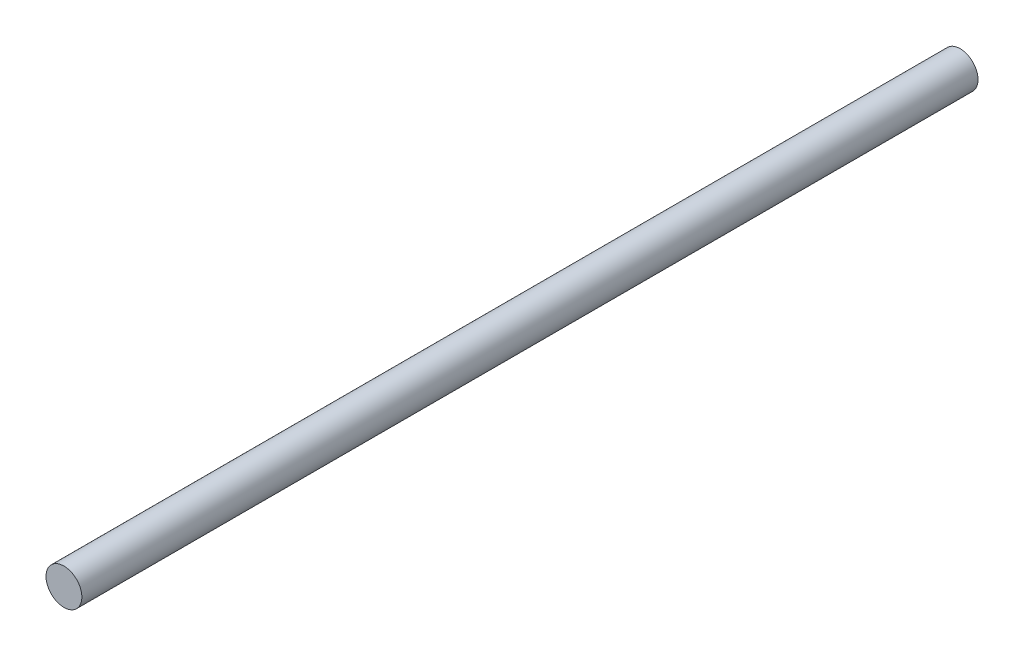
ISO-10303-21;
HEADER;
FILE_DESCRIPTION(('STEP AP214'),'2;1');
FILE_NAME('part.step','',(''),(''),'','','');
FILE_SCHEMA(('AUTOMOTIVE_DESIGN { 1 0 10303 214 1 1 1 1 }'));
ENDSEC;
DATA;
#1=APPLICATION_CONTEXT('core data for automotive mechanical design processes');
#2=APPLICATION_PROTOCOL_DEFINITION('international standard','automotive_design',2000,#1);
#3=PRODUCT_CONTEXT('',#1,'mechanical');
#4=PRODUCT('Part','Part','',(#3));
#5=PRODUCT_RELATED_PRODUCT_CATEGORY('part','',(#4));
#6=PRODUCT_DEFINITION_FORMATION('','',#4);
#7=PRODUCT_DEFINITION_CONTEXT('part definition',#1,'design');
#8=PRODUCT_DEFINITION('design','',#6,#7);
#9=PRODUCT_DEFINITION_SHAPE('','',#8);
#10=(LENGTH_UNIT() NAMED_UNIT(*) SI_UNIT(.MILLI.,.METRE.));
#11=(NAMED_UNIT(*) PLANE_ANGLE_UNIT() SI_UNIT($,.RADIAN.));
#12=(NAMED_UNIT(*) SI_UNIT($,.STERADIAN.) SOLID_ANGLE_UNIT());
#13=UNCERTAINTY_MEASURE_WITH_UNIT(LENGTH_MEASURE(1.E-05),#10,'distance_accuracy_value','');
#14=(GEOMETRIC_REPRESENTATION_CONTEXT(3) GLOBAL_UNCERTAINTY_ASSIGNED_CONTEXT((#13)) GLOBAL_UNIT_ASSIGNED_CONTEXT((#10,
#11,#12)) REPRESENTATION_CONTEXT('',''));
#15=CARTESIAN_POINT('',(0.,0.,0.));
#16=DIRECTION('',(0.,0.,1.));
#17=DIRECTION('',(1.,0.,0.));
#18=AXIS2_PLACEMENT_3D('',#15,#16,#17);
#19=CARTESIAN_POINT('',(0.,0.,317.5));
#20=DIRECTION('',(0.,0.,-1.));
#21=DIRECTION('',(-1.,0.,0.));
#22=AXIS2_PLACEMENT_3D('',#19,#20,#21);
#23=CYLINDRICAL_SURFACE('',#22,6.35);
#24=CARTESIAN_POINT('',(0.,0.,317.5));
#25=DIRECTION('',(0.,0.,1.));
#26=DIRECTION('',(1.,0.,0.));
#27=AXIS2_PLACEMENT_3D('',#24,#25,#26);
#28=CIRCLE('',#27,6.35);
#29=CARTESIAN_POINT('',(-6.35,0.,317.5));
#30=VERTEX_POINT('',#29);
#31=EDGE_CURVE('E10',#30,#30,#28,.T.);
#32=CARTESIAN_POINT('',(0.,0.,0.));
#33=DIRECTION('',(0.,0.,1.));
#34=DIRECTION('',(1.,0.,0.));
#35=AXIS2_PLACEMENT_3D('',#32,#33,#34);
#36=CIRCLE('',#35,6.35);
#37=CARTESIAN_POINT('',(-6.35,0.,0.));
#38=VERTEX_POINT('',#37);
#39=EDGE_CURVE('E34',#38,#38,#36,.T.);
#40=CARTESIAN_POINT('',(-6.35,0.,317.5));
#41=CARTESIAN_POINT('',(-6.35,0.,314.192708333333));
#42=CARTESIAN_POINT('',(-6.35,0.,310.885416666667));
#43=CARTESIAN_POINT('',(-6.35,0.,304.270833333333));
#44=CARTESIAN_POINT('',(-6.35,0.,300.963541666667));
#45=CARTESIAN_POINT('',(-6.35,0.,294.348958333333));
#46=CARTESIAN_POINT('',(-6.35,0.,291.041666666667));
#47=CARTESIAN_POINT('',(-6.35,0.,284.427083333333));
#48=CARTESIAN_POINT('',(-6.35,0.,281.119791666667));
#49=CARTESIAN_POINT('',(-6.35,0.,274.505208333333));
#50=CARTESIAN_POINT('',(-6.35,0.,271.197916666667));
#51=CARTESIAN_POINT('',(-6.35,0.,264.583333333333));
#52=CARTESIAN_POINT('',(-6.35,0.,261.276041666667));
#53=CARTESIAN_POINT('',(-6.35,0.,254.661458333333));
#54=CARTESIAN_POINT('',(-6.35,0.,251.354166666667));
#55=CARTESIAN_POINT('',(-6.35,0.,244.739583333333));
#56=CARTESIAN_POINT('',(-6.35,0.,241.432291666667));
#57=CARTESIAN_POINT('',(-6.35,0.,234.817708333333));
#58=CARTESIAN_POINT('',(-6.35,0.,231.510416666667));
#59=CARTESIAN_POINT('',(-6.35,0.,224.895833333333));
#60=CARTESIAN_POINT('',(-6.35,0.,221.588541666667));
#61=CARTESIAN_POINT('',(-6.35,0.,214.973958333333));
#62=CARTESIAN_POINT('',(-6.35,0.,211.666666666667));
#63=CARTESIAN_POINT('',(-6.35,0.,205.052083333333));
#64=CARTESIAN_POINT('',(-6.35,0.,201.744791666667));
#65=CARTESIAN_POINT('',(-6.35,0.,195.130208333333));
#66=CARTESIAN_POINT('',(-6.35,0.,191.822916666667));
#67=CARTESIAN_POINT('',(-6.35,0.,185.208333333333));
#68=CARTESIAN_POINT('',(-6.35,0.,181.901041666667));
#69=CARTESIAN_POINT('',(-6.35,0.,175.286458333333));
#70=CARTESIAN_POINT('',(-6.35,0.,171.979166666667));
#71=CARTESIAN_POINT('',(-6.35,0.,165.364583333333));
#72=CARTESIAN_POINT('',(-6.35,0.,162.057291666667));
#73=CARTESIAN_POINT('',(-6.35,0.,155.442708333333));
#74=CARTESIAN_POINT('',(-6.35,0.,152.135416666667));
#75=CARTESIAN_POINT('',(-6.35,0.,145.520833333333));
#76=CARTESIAN_POINT('',(-6.35,0.,142.213541666667));
#77=CARTESIAN_POINT('',(-6.35,0.,135.598958333333));
#78=CARTESIAN_POINT('',(-6.35,0.,132.291666666667));
#79=CARTESIAN_POINT('',(-6.35,0.,125.677083333333));
#80=CARTESIAN_POINT('',(-6.35,0.,122.369791666667));
#81=CARTESIAN_POINT('',(-6.35,0.,115.755208333333));
#82=CARTESIAN_POINT('',(-6.35,0.,112.447916666667));
#83=CARTESIAN_POINT('',(-6.35,0.,105.833333333333));
#84=CARTESIAN_POINT('',(-6.35,0.,102.526041666667));
#85=CARTESIAN_POINT('',(-6.35,0.,95.9114583333333));
#86=CARTESIAN_POINT('',(-6.35,0.,92.6041666666666));
#87=CARTESIAN_POINT('',(-6.35,0.,85.9895833333333));
#88=CARTESIAN_POINT('',(-6.35,0.,82.6822916666666));
#89=CARTESIAN_POINT('',(-6.35,0.,76.0677083333333));
#90=CARTESIAN_POINT('',(-6.35,0.,72.7604166666666));
#91=CARTESIAN_POINT('',(-6.35,0.,66.1458333333333));
#92=CARTESIAN_POINT('',(-6.35,0.,62.8385416666666));
#93=CARTESIAN_POINT('',(-6.35,0.,56.2239583333333));
#94=CARTESIAN_POINT('',(-6.35,0.,52.9166666666666));
#95=CARTESIAN_POINT('',(-6.35,0.,46.3020833333333));
#96=CARTESIAN_POINT('',(-6.35,0.,42.9947916666666));
#97=CARTESIAN_POINT('',(-6.35,0.,36.3802083333333));
#98=CARTESIAN_POINT('',(-6.35,0.,33.0729166666666));
#99=CARTESIAN_POINT('',(-6.35,0.,26.4583333333333));
#100=CARTESIAN_POINT('',(-6.35,0.,23.1510416666666));
#101=CARTESIAN_POINT('',(-6.35,0.,16.5364583333333));
#102=CARTESIAN_POINT('',(-6.35,0.,13.2291666666666));
#103=CARTESIAN_POINT('',(-6.35,0.,6.61458333333329));
#104=CARTESIAN_POINT('',(-6.35,0.,3.30729166666662));
#105=CARTESIAN_POINT('',(-6.35,0.,0.));
#106=B_SPLINE_CURVE_WITH_KNOTS('',3,(#40,#41,#42,#43,#44,#45,#46,#47,#48,#49,#50,#51,#52,#53,
#54,#55,#56,#57,#58,#59,#60,#61,#62,#63,#64,#65,#66,#67,#68,#69,#70,#71,#72,#73,#74,#75,#76,#77,
#78,#79,#80,#81,#82,#83,#84,#85,#86,#87,#88,#89,#90,#91,#92,#93,#94,#95,#96,#97,#98,#99,#100,
#101,#102,#103,#104,#105),.UNSPECIFIED.,.F.,.F.,(4,2,2,2,2,2,2,2,2,2,2,2,2,2,2,2,2,2,2,2,2,2,2,
2,2,2,2,2,2,2,2,2,4),(0.,9.92187499999997,19.84375,29.765625,39.6875,49.609375,59.53125,
69.453125,79.375,89.296875,99.21875,109.140625,119.0625,128.984375,138.90625,148.828125,158.75,
168.671875,178.59375,188.515625,198.4375,208.359375,218.28125,228.203125,238.125,248.046875,
257.96875,267.890625,277.8125,287.734375,297.65625,307.578125,317.5),.UNSPECIFIED.);
#107=EDGE_CURVE('BSEAM31',#30,#38,#106,.T.);
#108=ORIENTED_EDGE('',*,*,#31,.F.);
#109=ORIENTED_EDGE('',*,*,#39,.T.);
#110=ORIENTED_EDGE('',*,*,#107,.T.);
#111=ORIENTED_EDGE('',*,*,#107,.F.);
#112=EDGE_LOOP('',(#108,#110,#109,#111));
#113=FACE_BOUND('',#112,.T.);
#114=ADVANCED_FACE('F31',(#113),#23,.T.);
#115=CARTESIAN_POINT('',(0.,0.,317.5));
#116=DIRECTION('',(0.,0.,1.));
#117=DIRECTION('',(1.,0.,0.));
#118=AXIS2_PLACEMENT_3D('',#115,#116,#117);
#119=PLANE('',#118);
#120=ORIENTED_EDGE('',*,*,#31,.T.);
#121=EDGE_LOOP('',(#120));
#122=FACE_BOUND('',#121,.T.);
#123=ADVANCED_FACE('F46',(#122),#119,.T.);
#124=CARTESIAN_POINT('',(0.,0.,0.));
#125=DIRECTION('',(0.,0.,1.));
#126=DIRECTION('',(1.,0.,0.));
#127=AXIS2_PLACEMENT_3D('',#124,#125,#126);
#128=PLANE('',#127);
#129=ORIENTED_EDGE('',*,*,#39,.F.);
#130=EDGE_LOOP('',(#129));
#131=FACE_BOUND('',#130,.T.);
#132=ADVANCED_FACE('F44',(#131),#128,.F.);
#133=CLOSED_SHELL('',(#114,#123,#132));
#134=MANIFOLD_SOLID_BREP('B2',#133);
#135=ADVANCED_BREP_SHAPE_REPRESENTATION('',(#18,#134),#14);
#136=SHAPE_DEFINITION_REPRESENTATION(#9,#135);
ENDSEC;
END-ISO-10303-21;
